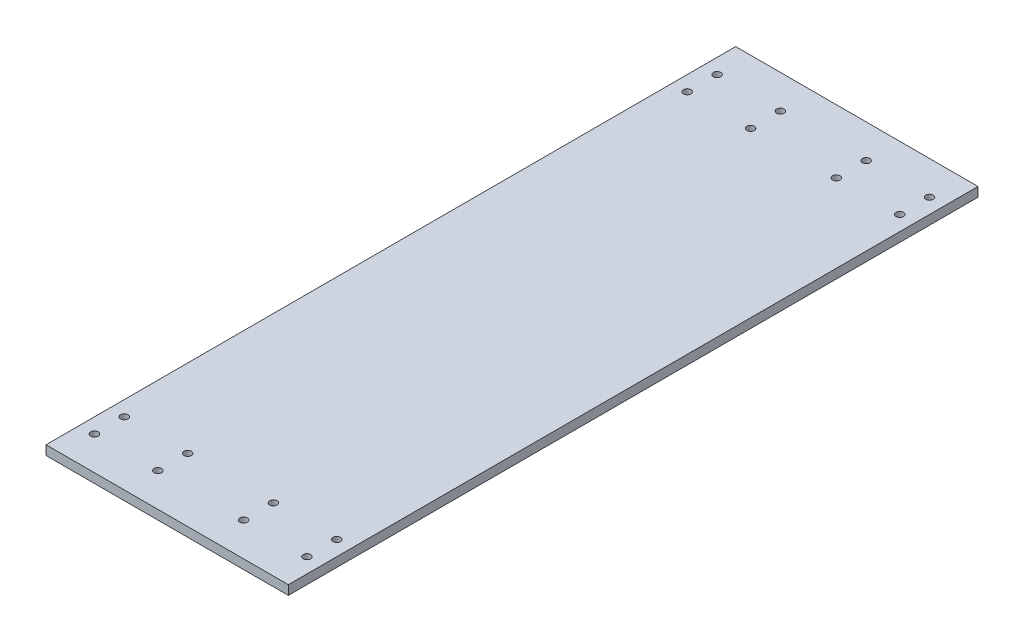
ISO-10303-21;
HEADER;
FILE_DESCRIPTION(('STEP AP214'),'2;1');
FILE_NAME('part.step','',(''),(''),'','','');
FILE_SCHEMA(('AUTOMOTIVE_DESIGN { 1 0 10303 214 1 1 1 1 }'));
ENDSEC;
DATA;
#1=APPLICATION_CONTEXT('core data for automotive mechanical design processes');
#2=APPLICATION_PROTOCOL_DEFINITION('international standard','automotive_design',2000,#1);
#3=PRODUCT_CONTEXT('',#1,'mechanical');
#4=PRODUCT('Part','Part','',(#3));
#5=PRODUCT_RELATED_PRODUCT_CATEGORY('part','',(#4));
#6=PRODUCT_DEFINITION_FORMATION('','',#4);
#7=PRODUCT_DEFINITION_CONTEXT('part definition',#1,'design');
#8=PRODUCT_DEFINITION('design','',#6,#7);
#9=PRODUCT_DEFINITION_SHAPE('','',#8);
#10=(LENGTH_UNIT() NAMED_UNIT(*) SI_UNIT(.MILLI.,.METRE.));
#11=(NAMED_UNIT(*) PLANE_ANGLE_UNIT() SI_UNIT($,.RADIAN.));
#12=(NAMED_UNIT(*) SI_UNIT($,.STERADIAN.) SOLID_ANGLE_UNIT());
#13=UNCERTAINTY_MEASURE_WITH_UNIT(LENGTH_MEASURE(1.E-05),#10,'distance_accuracy_value','');
#14=(GEOMETRIC_REPRESENTATION_CONTEXT(3) GLOBAL_UNCERTAINTY_ASSIGNED_CONTEXT((#13)) GLOBAL_UNIT_ASSIGNED_CONTEXT((#10,
#11,#12)) REPRESENTATION_CONTEXT('',''));
#15=CARTESIAN_POINT('',(0.,0.,0.));
#16=DIRECTION('',(0.,0.,1.));
#17=DIRECTION('',(1.,0.,0.));
#18=AXIS2_PLACEMENT_3D('',#15,#16,#17);
#19=CARTESIAN_POINT('',(65.,5.,185.));
#20=DIRECTION('',(-1.,0.,0.));
#21=DIRECTION('',(0.,0.,1.));
#22=AXIS2_PLACEMENT_3D('',#19,#20,#21);
#23=PLANE('',#22);
#24=DIRECTION('',(0.,0.,-1.));
#25=VECTOR('',#24,1.);
#26=CARTESIAN_POINT('',(65.,0.,185.));
#27=LINE('',#26,#25);
#28=CARTESIAN_POINT('',(65.,0.,185.));
#29=VERTEX_POINT('',#28);
#30=CARTESIAN_POINT('',(65.,0.,-185.));
#31=VERTEX_POINT('',#30);
#32=EDGE_CURVE('E102',#29,#31,#27,.T.);
#33=ORIENTED_EDGE('',*,*,#32,.T.);
#34=DIRECTION('',(0.,-1.,0.));
#35=VECTOR('',#34,1.);
#36=CARTESIAN_POINT('',(65.,5.,-185.));
#37=LINE('',#36,#35);
#38=CARTESIAN_POINT('',(65.,5.,-185.));
#39=VERTEX_POINT('',#38);
#40=EDGE_CURVE('E11',#39,#31,#37,.T.);
#41=ORIENTED_EDGE('',*,*,#40,.F.);
#42=DIRECTION('',(0.,0.,-1.));
#43=VECTOR('',#42,1.);
#44=CARTESIAN_POINT('',(65.,5.,185.));
#45=LINE('',#44,#43);
#46=CARTESIAN_POINT('',(65.,5.,185.));
#47=VERTEX_POINT('',#46);
#48=EDGE_CURVE('E89',#47,#39,#45,.T.);
#49=ORIENTED_EDGE('',*,*,#48,.F.);
#50=DIRECTION('',(0.,-1.,0.));
#51=VECTOR('',#50,1.);
#52=CARTESIAN_POINT('',(65.,5.,185.));
#53=LINE('',#52,#51);
#54=EDGE_CURVE('E98',#47,#29,#53,.T.);
#55=ORIENTED_EDGE('',*,*,#54,.T.);
#56=EDGE_LOOP('',(#33,#41,#49,#55));
#57=FACE_BOUND('',#56,.T.);
#58=ADVANCED_FACE('F36',(#57),#23,.F.);
#59=CARTESIAN_POINT('',(-65.,5.,-185.));
#60=DIRECTION('',(0.,0.,1.));
#61=DIRECTION('',(1.,0.,0.));
#62=AXIS2_PLACEMENT_3D('',#59,#60,#61);
#63=PLANE('',#62);
#64=DIRECTION('',(-1.,0.,0.));
#65=VECTOR('',#64,1.);
#66=CARTESIAN_POINT('',(-65.,0.,-185.));
#67=LINE('',#66,#65);
#68=CARTESIAN_POINT('',(-65.,0.,-185.));
#69=VERTEX_POINT('',#68);
#70=EDGE_CURVE('E93',#31,#69,#67,.T.);
#71=ORIENTED_EDGE('',*,*,#70,.T.);
#72=DIRECTION('',(0.,-1.,0.));
#73=VECTOR('',#72,1.);
#74=CARTESIAN_POINT('',(-65.,5.,-185.));
#75=LINE('',#74,#73);
#76=CARTESIAN_POINT('',(-65.,5.,-185.));
#77=VERTEX_POINT('',#76);
#78=EDGE_CURVE('E45',#77,#69,#75,.T.);
#79=ORIENTED_EDGE('',*,*,#78,.F.);
#80=DIRECTION('',(-1.,0.,0.));
#81=VECTOR('',#80,1.);
#82=CARTESIAN_POINT('',(-65.,5.,-185.));
#83=LINE('',#82,#81);
#84=EDGE_CURVE('E84',#39,#77,#83,.T.);
#85=ORIENTED_EDGE('',*,*,#84,.F.);
#86=ORIENTED_EDGE('',*,*,#40,.T.);
#87=EDGE_LOOP('',(#71,#79,#85,#86));
#88=FACE_BOUND('',#87,.T.);
#89=ADVANCED_FACE('F92',(#88),#63,.F.);
#90=CARTESIAN_POINT('',(-65.,5.,185.));
#91=DIRECTION('',(1.,0.,0.));
#92=DIRECTION('',(0.,0.,-1.));
#93=AXIS2_PLACEMENT_3D('',#90,#91,#92);
#94=PLANE('',#93);
#95=DIRECTION('',(0.,0.,1.));
#96=VECTOR('',#95,1.);
#97=CARTESIAN_POINT('',(-65.,0.,185.));
#98=LINE('',#97,#96);
#99=CARTESIAN_POINT('',(-65.,0.,185.));
#100=VERTEX_POINT('',#99);
#101=EDGE_CURVE('E71',#69,#100,#98,.T.);
#102=ORIENTED_EDGE('',*,*,#101,.T.);
#103=DIRECTION('',(0.,-1.,0.));
#104=VECTOR('',#103,1.);
#105=CARTESIAN_POINT('',(-65.,5.,185.));
#106=LINE('',#105,#104);
#107=CARTESIAN_POINT('',(-65.,5.,185.));
#108=VERTEX_POINT('',#107);
#109=EDGE_CURVE('E94',#108,#100,#106,.T.);
#110=ORIENTED_EDGE('',*,*,#109,.F.);
#111=DIRECTION('',(0.,0.,1.));
#112=VECTOR('',#111,1.);
#113=CARTESIAN_POINT('',(-65.,5.,185.));
#114=LINE('',#113,#112);
#115=EDGE_CURVE('E87',#77,#108,#114,.T.);
#116=ORIENTED_EDGE('',*,*,#115,.F.);
#117=ORIENTED_EDGE('',*,*,#78,.T.);
#118=EDGE_LOOP('',(#102,#110,#116,#117));
#119=FACE_BOUND('',#118,.T.);
#120=ADVANCED_FACE('F96',(#119),#94,.F.);
#121=CARTESIAN_POINT('',(-65.,5.,185.));
#122=DIRECTION('',(0.,0.,-1.));
#123=DIRECTION('',(-1.,0.,0.));
#124=AXIS2_PLACEMENT_3D('',#121,#122,#123);
#125=PLANE('',#124);
#126=DIRECTION('',(1.,0.,0.));
#127=VECTOR('',#126,1.);
#128=CARTESIAN_POINT('',(-65.,0.,185.));
#129=LINE('',#128,#127);
#130=EDGE_CURVE('E77',#100,#29,#129,.T.);
#131=ORIENTED_EDGE('',*,*,#130,.T.);
#132=ORIENTED_EDGE('',*,*,#54,.F.);
#133=DIRECTION('',(1.,0.,0.));
#134=VECTOR('',#133,1.);
#135=CARTESIAN_POINT('',(-65.,5.,185.));
#136=LINE('',#135,#134);
#137=EDGE_CURVE('E54',#108,#47,#136,.T.);
#138=ORIENTED_EDGE('',*,*,#137,.F.);
#139=ORIENTED_EDGE('',*,*,#109,.T.);
#140=EDGE_LOOP('',(#131,#132,#138,#139));
#141=FACE_BOUND('',#140,.T.);
#142=ADVANCED_FACE('F205',(#141),#125,.F.);
#143=CARTESIAN_POINT('',(0.,5.,0.));
#144=DIRECTION('',(0.,-1.,0.));
#145=DIRECTION('',(0.,0.,-1.));
#146=AXIS2_PLACEMENT_3D('',#143,#144,#145);
#147=PLANE('',#146);
#148=CARTESIAN_POINT('',(57.,5.,151.));
#149=DIRECTION('',(0.,1.,0.));
#150=DIRECTION('',(0.,0.,-1.));
#151=AXIS2_PLACEMENT_3D('',#148,#149,#150);
#152=CIRCLE('',#151,2.);
#153=CARTESIAN_POINT('',(57.,5.,149.));
#154=VERTEX_POINT('',#153);
#155=EDGE_CURVE('E407',#154,#154,#152,.T.);
#156=ORIENTED_EDGE('',*,*,#155,.F.);
#157=EDGE_LOOP('',(#156));
#158=FACE_BOUND('',#157,.T.);
#159=CARTESIAN_POINT('',(23.,5.,167.));
#160=DIRECTION('',(0.,1.,0.));
#161=DIRECTION('',(0.,0.,-1.));
#162=AXIS2_PLACEMENT_3D('',#159,#160,#161);
#163=CIRCLE('',#162,2.);
#164=CARTESIAN_POINT('',(23.,5.,165.));
#165=VERTEX_POINT('',#164);
#166=EDGE_CURVE('E408',#165,#165,#163,.T.);
#167=ORIENTED_EDGE('',*,*,#166,.F.);
#168=EDGE_LOOP('',(#167));
#169=FACE_BOUND('',#168,.T.);
#170=CARTESIAN_POINT('',(23.,5.,151.));
#171=DIRECTION('',(0.,1.,0.));
#172=DIRECTION('',(0.,0.,-1.));
#173=AXIS2_PLACEMENT_3D('',#170,#171,#172);
#174=CIRCLE('',#173,2.);
#175=CARTESIAN_POINT('',(23.,5.,149.));
#176=VERTEX_POINT('',#175);
#177=EDGE_CURVE('E412',#176,#176,#174,.T.);
#178=ORIENTED_EDGE('',*,*,#177,.F.);
#179=EDGE_LOOP('',(#178));
#180=FACE_BOUND('',#179,.T.);
#181=CARTESIAN_POINT('',(57.,5.,167.));
#182=DIRECTION('',(0.,1.,0.));
#183=DIRECTION('',(0.,0.,-1.));
#184=AXIS2_PLACEMENT_3D('',#181,#182,#183);
#185=CIRCLE('',#184,2.);
#186=CARTESIAN_POINT('',(57.,5.,165.));
#187=VERTEX_POINT('',#186);
#188=EDGE_CURVE('E155',#187,#187,#185,.T.);
#189=ORIENTED_EDGE('',*,*,#188,.F.);
#190=EDGE_LOOP('',(#189));
#191=FACE_BOUND('',#190,.T.);
#192=CARTESIAN_POINT('',(-57.,5.,151.));
#193=DIRECTION('',(0.,-1.,0.));
#194=DIRECTION('',(0.,0.,-1.));
#195=AXIS2_PLACEMENT_3D('',#192,#193,#194);
#196=CIRCLE('',#195,2.);
#197=CARTESIAN_POINT('',(-57.,5.,149.));
#198=VERTEX_POINT('',#197);
#199=EDGE_CURVE('E171',#198,#198,#196,.T.);
#200=ORIENTED_EDGE('',*,*,#199,.T.);
#201=EDGE_LOOP('',(#200));
#202=FACE_BOUND('',#201,.T.);
#203=CARTESIAN_POINT('',(-23.,5.,167.));
#204=DIRECTION('',(0.,-1.,0.));
#205=DIRECTION('',(0.,0.,-1.));
#206=AXIS2_PLACEMENT_3D('',#203,#204,#205);
#207=CIRCLE('',#206,2.);
#208=CARTESIAN_POINT('',(-23.,5.,165.));
#209=VERTEX_POINT('',#208);
#210=EDGE_CURVE('E166',#209,#209,#207,.T.);
#211=ORIENTED_EDGE('',*,*,#210,.T.);
#212=EDGE_LOOP('',(#211));
#213=FACE_BOUND('',#212,.T.);
#214=CARTESIAN_POINT('',(-23.,5.,151.));
#215=DIRECTION('',(0.,-1.,0.));
#216=DIRECTION('',(0.,0.,-1.));
#217=AXIS2_PLACEMENT_3D('',#214,#215,#216);
#218=CIRCLE('',#217,2.);
#219=CARTESIAN_POINT('',(-23.,5.,149.));
#220=VERTEX_POINT('',#219);
#221=EDGE_CURVE('E162',#220,#220,#218,.T.);
#222=ORIENTED_EDGE('',*,*,#221,.T.);
#223=EDGE_LOOP('',(#222));
#224=FACE_BOUND('',#223,.T.);
#225=CARTESIAN_POINT('',(-57.,5.,167.));
#226=DIRECTION('',(0.,-1.,0.));
#227=DIRECTION('',(0.,0.,-1.));
#228=AXIS2_PLACEMENT_3D('',#225,#226,#227);
#229=CIRCLE('',#228,2.);
#230=CARTESIAN_POINT('',(-57.,5.,165.));
#231=VERTEX_POINT('',#230);
#232=EDGE_CURVE('E141',#231,#231,#229,.T.);
#233=ORIENTED_EDGE('',*,*,#232,.T.);
#234=EDGE_LOOP('',(#233));
#235=FACE_BOUND('',#234,.T.);
#236=CARTESIAN_POINT('',(57.,5.,-151.));
#237=DIRECTION('',(0.,-1.,0.));
#238=DIRECTION('',(0.,0.,1.));
#239=AXIS2_PLACEMENT_3D('',#236,#237,#238);
#240=CIRCLE('',#239,2.);
#241=CARTESIAN_POINT('',(57.,5.,-149.));
#242=VERTEX_POINT('',#241);
#243=EDGE_CURVE('E183',#242,#242,#240,.T.);
#244=ORIENTED_EDGE('',*,*,#243,.T.);
#245=EDGE_LOOP('',(#244));
#246=FACE_BOUND('',#245,.T.);
#247=CARTESIAN_POINT('',(23.,5.,-167.));
#248=DIRECTION('',(0.,-1.,0.));
#249=DIRECTION('',(0.,0.,1.));
#250=AXIS2_PLACEMENT_3D('',#247,#248,#249);
#251=CIRCLE('',#250,2.);
#252=CARTESIAN_POINT('',(23.,5.,-165.));
#253=VERTEX_POINT('',#252);
#254=EDGE_CURVE('E182',#253,#253,#251,.T.);
#255=ORIENTED_EDGE('',*,*,#254,.T.);
#256=EDGE_LOOP('',(#255));
#257=FACE_BOUND('',#256,.T.);
#258=CARTESIAN_POINT('',(23.,5.,-151.));
#259=DIRECTION('',(0.,-1.,0.));
#260=DIRECTION('',(0.,0.,1.));
#261=AXIS2_PLACEMENT_3D('',#258,#259,#260);
#262=CIRCLE('',#261,2.);
#263=CARTESIAN_POINT('',(23.,5.,-149.));
#264=VERTEX_POINT('',#263);
#265=EDGE_CURVE('E150',#264,#264,#262,.T.);
#266=ORIENTED_EDGE('',*,*,#265,.T.);
#267=EDGE_LOOP('',(#266));
#268=FACE_BOUND('',#267,.T.);
#269=CARTESIAN_POINT('',(57.,5.,-167.));
#270=DIRECTION('',(0.,-1.,0.));
#271=DIRECTION('',(0.,0.,1.));
#272=AXIS2_PLACEMENT_3D('',#269,#270,#271);
#273=CIRCLE('',#272,2.);
#274=CARTESIAN_POINT('',(57.,5.,-165.));
#275=VERTEX_POINT('',#274);
#276=EDGE_CURVE('E127',#275,#275,#273,.T.);
#277=ORIENTED_EDGE('',*,*,#276,.T.);
#278=EDGE_LOOP('',(#277));
#279=FACE_BOUND('',#278,.T.);
#280=CARTESIAN_POINT('',(-57.,5.,-151.));
#281=DIRECTION('',(0.,1.,0.));
#282=DIRECTION('',(0.,0.,1.));
#283=AXIS2_PLACEMENT_3D('',#280,#281,#282);
#284=CIRCLE('',#283,2.);
#285=CARTESIAN_POINT('',(-57.,5.,-149.));
#286=VERTEX_POINT('',#285);
#287=EDGE_CURVE('E193',#286,#286,#284,.T.);
#288=ORIENTED_EDGE('',*,*,#287,.F.);
#289=EDGE_LOOP('',(#288));
#290=FACE_BOUND('',#289,.T.);
#291=CARTESIAN_POINT('',(-23.,5.,-167.));
#292=DIRECTION('',(0.,1.,0.));
#293=DIRECTION('',(0.,0.,1.));
#294=AXIS2_PLACEMENT_3D('',#291,#292,#293);
#295=CIRCLE('',#294,2.);
#296=CARTESIAN_POINT('',(-23.,5.,-165.));
#297=VERTEX_POINT('',#296);
#298=EDGE_CURVE('E192',#297,#297,#295,.T.);
#299=ORIENTED_EDGE('',*,*,#298,.F.);
#300=EDGE_LOOP('',(#299));
#301=FACE_BOUND('',#300,.T.);
#302=CARTESIAN_POINT('',(-23.,5.,-151.));
#303=DIRECTION('',(0.,1.,0.));
#304=DIRECTION('',(0.,0.,1.));
#305=AXIS2_PLACEMENT_3D('',#302,#303,#304);
#306=CIRCLE('',#305,2.);
#307=CARTESIAN_POINT('',(-23.,5.,-149.));
#308=VERTEX_POINT('',#307);
#309=EDGE_CURVE('E136',#308,#308,#306,.T.);
#310=ORIENTED_EDGE('',*,*,#309,.F.);
#311=EDGE_LOOP('',(#310));
#312=FACE_BOUND('',#311,.T.);
#313=CARTESIAN_POINT('',(-57.,5.,-167.));
#314=DIRECTION('',(0.,1.,0.));
#315=DIRECTION('',(0.,0.,1.));
#316=AXIS2_PLACEMENT_3D('',#313,#314,#315);
#317=CIRCLE('',#316,2.);
#318=CARTESIAN_POINT('',(-57.,5.,-165.));
#319=VERTEX_POINT('',#318);
#320=EDGE_CURVE('E115',#319,#319,#317,.T.);
#321=ORIENTED_EDGE('',*,*,#320,.F.);
#322=EDGE_LOOP('',(#321));
#323=FACE_BOUND('',#322,.T.);
#324=ORIENTED_EDGE('',*,*,#48,.T.);
#325=ORIENTED_EDGE('',*,*,#84,.T.);
#326=ORIENTED_EDGE('',*,*,#115,.T.);
#327=ORIENTED_EDGE('',*,*,#137,.T.);
#328=EDGE_LOOP('',(#324,#325,#326,#327));
#329=FACE_BOUND('',#328,.T.);
#330=ADVANCED_FACE('F85',(#158,#169,#180,#191,#202,#213,#224,#235,#246,#257,#268,#279,#290,#301,
#312,#323,#329),#147,.F.);
#331=CARTESIAN_POINT('',(0.,0.,0.));
#332=DIRECTION('',(0.,-1.,0.));
#333=DIRECTION('',(0.,0.,-1.));
#334=AXIS2_PLACEMENT_3D('',#331,#332,#333);
#335=PLANE('',#334);
#336=CARTESIAN_POINT('',(57.,0.,151.));
#337=DIRECTION('',(0.,-1.,0.));
#338=DIRECTION('',(0.,0.,-1.));
#339=AXIS2_PLACEMENT_3D('',#336,#337,#338);
#340=CIRCLE('',#339,2.);
#341=CARTESIAN_POINT('',(57.,0.,149.));
#342=VERTEX_POINT('',#341);
#343=EDGE_CURVE('E39',#342,#342,#340,.T.);
#344=ORIENTED_EDGE('',*,*,#343,.F.);
#345=EDGE_LOOP('',(#344));
#346=FACE_BOUND('',#345,.T.);
#347=CARTESIAN_POINT('',(23.,0.,167.));
#348=DIRECTION('',(0.,-1.,0.));
#349=DIRECTION('',(0.,0.,-1.));
#350=AXIS2_PLACEMENT_3D('',#347,#348,#349);
#351=CIRCLE('',#350,2.);
#352=CARTESIAN_POINT('',(23.,0.,165.));
#353=VERTEX_POINT('',#352);
#354=EDGE_CURVE('E157',#353,#353,#351,.T.);
#355=ORIENTED_EDGE('',*,*,#354,.F.);
#356=EDGE_LOOP('',(#355));
#357=FACE_BOUND('',#356,.T.);
#358=CARTESIAN_POINT('',(23.,0.,151.));
#359=DIRECTION('',(0.,-1.,0.));
#360=DIRECTION('',(0.,0.,-1.));
#361=AXIS2_PLACEMENT_3D('',#358,#359,#360);
#362=CIRCLE('',#361,2.);
#363=CARTESIAN_POINT('',(23.,0.,149.));
#364=VERTEX_POINT('',#363);
#365=EDGE_CURVE('E154',#364,#364,#362,.T.);
#366=ORIENTED_EDGE('',*,*,#365,.F.);
#367=EDGE_LOOP('',(#366));
#368=FACE_BOUND('',#367,.T.);
#369=CARTESIAN_POINT('',(57.,0.,167.));
#370=DIRECTION('',(0.,-1.,0.));
#371=DIRECTION('',(0.,0.,-1.));
#372=AXIS2_PLACEMENT_3D('',#369,#370,#371);
#373=CIRCLE('',#372,2.);
#374=CARTESIAN_POINT('',(57.,0.,165.));
#375=VERTEX_POINT('',#374);
#376=EDGE_CURVE('E151',#375,#375,#373,.T.);
#377=ORIENTED_EDGE('',*,*,#376,.F.);
#378=EDGE_LOOP('',(#377));
#379=FACE_BOUND('',#378,.T.);
#380=CARTESIAN_POINT('',(-57.,0.,151.));
#381=DIRECTION('',(0.,-1.,0.));
#382=DIRECTION('',(0.,0.,-1.));
#383=AXIS2_PLACEMENT_3D('',#380,#381,#382);
#384=CIRCLE('',#383,2.);
#385=CARTESIAN_POINT('',(-57.,0.,149.));
#386=VERTEX_POINT('',#385);
#387=EDGE_CURVE('E147',#386,#386,#384,.F.);
#388=ORIENTED_EDGE('',*,*,#387,.T.);
#389=EDGE_LOOP('',(#388));
#390=FACE_BOUND('',#389,.T.);
#391=CARTESIAN_POINT('',(-23.,0.,167.));
#392=DIRECTION('',(0.,-1.,0.));
#393=DIRECTION('',(0.,0.,-1.));
#394=AXIS2_PLACEMENT_3D('',#391,#392,#393);
#395=CIRCLE('',#394,2.);
#396=CARTESIAN_POINT('',(-23.,0.,165.));
#397=VERTEX_POINT('',#396);
#398=EDGE_CURVE('E144',#397,#397,#395,.F.);
#399=ORIENTED_EDGE('',*,*,#398,.T.);
#400=EDGE_LOOP('',(#399));
#401=FACE_BOUND('',#400,.T.);
#402=CARTESIAN_POINT('',(-23.,0.,151.));
#403=DIRECTION('',(0.,-1.,0.));
#404=DIRECTION('',(0.,0.,-1.));
#405=AXIS2_PLACEMENT_3D('',#402,#403,#404);
#406=CIRCLE('',#405,2.);
#407=CARTESIAN_POINT('',(-23.,0.,149.));
#408=VERTEX_POINT('',#407);
#409=EDGE_CURVE('E140',#408,#408,#406,.F.);
#410=ORIENTED_EDGE('',*,*,#409,.T.);
#411=EDGE_LOOP('',(#410));
#412=FACE_BOUND('',#411,.T.);
#413=CARTESIAN_POINT('',(-57.,0.,167.));
#414=DIRECTION('',(0.,-1.,0.));
#415=DIRECTION('',(0.,0.,-1.));
#416=AXIS2_PLACEMENT_3D('',#413,#414,#415);
#417=CIRCLE('',#416,2.);
#418=CARTESIAN_POINT('',(-57.,0.,165.));
#419=VERTEX_POINT('',#418);
#420=EDGE_CURVE('E137',#419,#419,#417,.F.);
#421=ORIENTED_EDGE('',*,*,#420,.T.);
#422=EDGE_LOOP('',(#421));
#423=FACE_BOUND('',#422,.T.);
#424=CARTESIAN_POINT('',(57.,0.,-151.));
#425=DIRECTION('',(0.,-1.,0.));
#426=DIRECTION('',(0.,0.,-1.));
#427=AXIS2_PLACEMENT_3D('',#424,#425,#426);
#428=CIRCLE('',#427,2.);
#429=CARTESIAN_POINT('',(57.,0.,-153.));
#430=VERTEX_POINT('',#429);
#431=EDGE_CURVE('E133',#430,#430,#428,.F.);
#432=ORIENTED_EDGE('',*,*,#431,.T.);
#433=EDGE_LOOP('',(#432));
#434=FACE_BOUND('',#433,.T.);
#435=CARTESIAN_POINT('',(23.,0.,-167.));
#436=DIRECTION('',(0.,-1.,0.));
#437=DIRECTION('',(0.,0.,-1.));
#438=AXIS2_PLACEMENT_3D('',#435,#436,#437);
#439=CIRCLE('',#438,2.);
#440=CARTESIAN_POINT('',(23.,0.,-169.));
#441=VERTEX_POINT('',#440);
#442=EDGE_CURVE('E130',#441,#441,#439,.F.);
#443=ORIENTED_EDGE('',*,*,#442,.T.);
#444=EDGE_LOOP('',(#443));
#445=FACE_BOUND('',#444,.T.);
#446=CARTESIAN_POINT('',(23.,0.,-151.));
#447=DIRECTION('',(0.,-1.,0.));
#448=DIRECTION('',(0.,0.,-1.));
#449=AXIS2_PLACEMENT_3D('',#446,#447,#448);
#450=CIRCLE('',#449,2.);
#451=CARTESIAN_POINT('',(23.,0.,-153.));
#452=VERTEX_POINT('',#451);
#453=EDGE_CURVE('E126',#452,#452,#450,.F.);
#454=ORIENTED_EDGE('',*,*,#453,.T.);
#455=EDGE_LOOP('',(#454));
#456=FACE_BOUND('',#455,.T.);
#457=CARTESIAN_POINT('',(57.,0.,-167.));
#458=DIRECTION('',(0.,-1.,0.));
#459=DIRECTION('',(0.,0.,-1.));
#460=AXIS2_PLACEMENT_3D('',#457,#458,#459);
#461=CIRCLE('',#460,2.);
#462=CARTESIAN_POINT('',(57.,0.,-169.));
#463=VERTEX_POINT('',#462);
#464=EDGE_CURVE('E123',#463,#463,#461,.F.);
#465=ORIENTED_EDGE('',*,*,#464,.T.);
#466=EDGE_LOOP('',(#465));
#467=FACE_BOUND('',#466,.T.);
#468=CARTESIAN_POINT('',(-57.,0.,-151.));
#469=DIRECTION('',(0.,-1.,0.));
#470=DIRECTION('',(0.,0.,-1.));
#471=AXIS2_PLACEMENT_3D('',#468,#469,#470);
#472=CIRCLE('',#471,2.);
#473=CARTESIAN_POINT('',(-57.,0.,-153.));
#474=VERTEX_POINT('',#473);
#475=EDGE_CURVE('E105',#474,#474,#472,.T.);
#476=ORIENTED_EDGE('',*,*,#475,.F.);
#477=EDGE_LOOP('',(#476));
#478=FACE_BOUND('',#477,.T.);
#479=CARTESIAN_POINT('',(-23.,0.,-167.));
#480=DIRECTION('',(0.,-1.,0.));
#481=DIRECTION('',(0.,0.,-1.));
#482=AXIS2_PLACEMENT_3D('',#479,#480,#481);
#483=CIRCLE('',#482,2.);
#484=CARTESIAN_POINT('',(-23.,0.,-169.));
#485=VERTEX_POINT('',#484);
#486=EDGE_CURVE('E118',#485,#485,#483,.T.);
#487=ORIENTED_EDGE('',*,*,#486,.F.);
#488=EDGE_LOOP('',(#487));
#489=FACE_BOUND('',#488,.T.);
#490=CARTESIAN_POINT('',(-23.,0.,-151.));
#491=DIRECTION('',(0.,-1.,0.));
#492=DIRECTION('',(0.,0.,-1.));
#493=AXIS2_PLACEMENT_3D('',#490,#491,#492);
#494=CIRCLE('',#493,2.);
#495=CARTESIAN_POINT('',(-23.,0.,-153.));
#496=VERTEX_POINT('',#495);
#497=EDGE_CURVE('E114',#496,#496,#494,.T.);
#498=ORIENTED_EDGE('',*,*,#497,.F.);
#499=EDGE_LOOP('',(#498));
#500=FACE_BOUND('',#499,.T.);
#501=CARTESIAN_POINT('',(-57.,0.,-167.));
#502=DIRECTION('',(0.,-1.,0.));
#503=DIRECTION('',(0.,0.,-1.));
#504=AXIS2_PLACEMENT_3D('',#501,#502,#503);
#505=CIRCLE('',#504,2.);
#506=CARTESIAN_POINT('',(-57.,0.,-169.));
#507=VERTEX_POINT('',#506);
#508=EDGE_CURVE('E111',#507,#507,#505,.T.);
#509=ORIENTED_EDGE('',*,*,#508,.F.);
#510=EDGE_LOOP('',(#509));
#511=FACE_BOUND('',#510,.T.);
#512=ORIENTED_EDGE('',*,*,#32,.F.);
#513=ORIENTED_EDGE('',*,*,#130,.F.);
#514=ORIENTED_EDGE('',*,*,#101,.F.);
#515=ORIENTED_EDGE('',*,*,#70,.F.);
#516=EDGE_LOOP('',(#512,#513,#514,#515));
#517=FACE_BOUND('',#516,.T.);
#518=ADVANCED_FACE('F204',(#346,#357,#368,#379,#390,#401,#412,#423,#434,#445,#456,#467,#478,
#489,#500,#511,#517),#335,.T.);
#519=CARTESIAN_POINT('',(-57.,-5.,-167.));
#520=DIRECTION('',(0.,1.,0.));
#521=DIRECTION('',(0.,0.,1.));
#522=AXIS2_PLACEMENT_3D('',#519,#520,#521);
#523=CYLINDRICAL_SURFACE('',#522,2.);
#524=ORIENTED_EDGE('',*,*,#508,.T.);
#525=EDGE_LOOP('',(#524));
#526=FACE_BOUND('',#525,.T.);
#527=ORIENTED_EDGE('',*,*,#320,.T.);
#528=EDGE_LOOP('',(#527));
#529=FACE_BOUND('',#528,.T.);
#530=ADVANCED_FACE('F201',(#526,#529),#523,.F.);
#531=CARTESIAN_POINT('',(-23.,-5.,-151.));
#532=DIRECTION('',(0.,1.,0.));
#533=DIRECTION('',(0.,0.,1.));
#534=AXIS2_PLACEMENT_3D('',#531,#532,#533);
#535=CYLINDRICAL_SURFACE('',#534,2.);
#536=ORIENTED_EDGE('',*,*,#497,.T.);
#537=EDGE_LOOP('',(#536));
#538=FACE_BOUND('',#537,.T.);
#539=ORIENTED_EDGE('',*,*,#309,.T.);
#540=EDGE_LOOP('',(#539));
#541=FACE_BOUND('',#540,.T.);
#542=ADVANCED_FACE('F245',(#538,#541),#535,.F.);
#543=CARTESIAN_POINT('',(-23.,-5.,-167.));
#544=DIRECTION('',(0.,1.,0.));
#545=DIRECTION('',(0.,0.,1.));
#546=AXIS2_PLACEMENT_3D('',#543,#544,#545);
#547=CYLINDRICAL_SURFACE('',#546,2.);
#548=ORIENTED_EDGE('',*,*,#486,.T.);
#549=EDGE_LOOP('',(#548));
#550=FACE_BOUND('',#549,.T.);
#551=ORIENTED_EDGE('',*,*,#298,.T.);
#552=EDGE_LOOP('',(#551));
#553=FACE_BOUND('',#552,.T.);
#554=ADVANCED_FACE('F255',(#550,#553),#547,.F.);
#555=CARTESIAN_POINT('',(-57.,-5.,-151.));
#556=DIRECTION('',(0.,1.,0.));
#557=DIRECTION('',(0.,0.,1.));
#558=AXIS2_PLACEMENT_3D('',#555,#556,#557);
#559=CYLINDRICAL_SURFACE('',#558,2.);
#560=ORIENTED_EDGE('',*,*,#475,.T.);
#561=EDGE_LOOP('',(#560));
#562=FACE_BOUND('',#561,.T.);
#563=ORIENTED_EDGE('',*,*,#287,.T.);
#564=EDGE_LOOP('',(#563));
#565=FACE_BOUND('',#564,.T.);
#566=ADVANCED_FACE('F265',(#562,#565),#559,.F.);
#567=CARTESIAN_POINT('',(57.,-5.,-167.));
#568=DIRECTION('',(0.,1.,0.));
#569=DIRECTION('',(0.,0.,1.));
#570=AXIS2_PLACEMENT_3D('',#567,#568,#569);
#571=CYLINDRICAL_SURFACE('',#570,2.);
#572=ORIENTED_EDGE('',*,*,#464,.F.);
#573=EDGE_LOOP('',(#572));
#574=FACE_BOUND('',#573,.T.);
#575=ORIENTED_EDGE('',*,*,#276,.F.);
#576=EDGE_LOOP('',(#575));
#577=FACE_BOUND('',#576,.T.);
#578=ADVANCED_FACE('F274',(#574,#577),#571,.F.);
#579=CARTESIAN_POINT('',(23.,-5.,-151.));
#580=DIRECTION('',(0.,1.,0.));
#581=DIRECTION('',(0.,0.,1.));
#582=AXIS2_PLACEMENT_3D('',#579,#580,#581);
#583=CYLINDRICAL_SURFACE('',#582,2.);
#584=ORIENTED_EDGE('',*,*,#453,.F.);
#585=EDGE_LOOP('',(#584));
#586=FACE_BOUND('',#585,.T.);
#587=ORIENTED_EDGE('',*,*,#265,.F.);
#588=EDGE_LOOP('',(#587));
#589=FACE_BOUND('',#588,.T.);
#590=ADVANCED_FACE('F293',(#586,#589),#583,.F.);
#591=CARTESIAN_POINT('',(23.,-5.,-167.));
#592=DIRECTION('',(0.,1.,0.));
#593=DIRECTION('',(0.,0.,1.));
#594=AXIS2_PLACEMENT_3D('',#591,#592,#593);
#595=CYLINDRICAL_SURFACE('',#594,2.);
#596=ORIENTED_EDGE('',*,*,#442,.F.);
#597=EDGE_LOOP('',(#596));
#598=FACE_BOUND('',#597,.T.);
#599=ORIENTED_EDGE('',*,*,#254,.F.);
#600=EDGE_LOOP('',(#599));
#601=FACE_BOUND('',#600,.T.);
#602=ADVANCED_FACE('F303',(#598,#601),#595,.F.);
#603=CARTESIAN_POINT('',(57.,-5.,-151.));
#604=DIRECTION('',(0.,1.,0.));
#605=DIRECTION('',(0.,0.,1.));
#606=AXIS2_PLACEMENT_3D('',#603,#604,#605);
#607=CYLINDRICAL_SURFACE('',#606,2.);
#608=ORIENTED_EDGE('',*,*,#431,.F.);
#609=EDGE_LOOP('',(#608));
#610=FACE_BOUND('',#609,.T.);
#611=ORIENTED_EDGE('',*,*,#243,.F.);
#612=EDGE_LOOP('',(#611));
#613=FACE_BOUND('',#612,.T.);
#614=ADVANCED_FACE('F313',(#610,#613),#607,.F.);
#615=CARTESIAN_POINT('',(-57.,-5.,167.));
#616=DIRECTION('',(0.,1.,0.));
#617=DIRECTION('',(0.,0.,1.));
#618=AXIS2_PLACEMENT_3D('',#615,#616,#617);
#619=CYLINDRICAL_SURFACE('',#618,2.);
#620=ORIENTED_EDGE('',*,*,#420,.F.);
#621=EDGE_LOOP('',(#620));
#622=FACE_BOUND('',#621,.T.);
#623=ORIENTED_EDGE('',*,*,#232,.F.);
#624=EDGE_LOOP('',(#623));
#625=FACE_BOUND('',#624,.T.);
#626=ADVANCED_FACE('F323',(#622,#625),#619,.F.);
#627=CARTESIAN_POINT('',(-23.,-5.,151.));
#628=DIRECTION('',(0.,1.,0.));
#629=DIRECTION('',(0.,0.,1.));
#630=AXIS2_PLACEMENT_3D('',#627,#628,#629);
#631=CYLINDRICAL_SURFACE('',#630,2.);
#632=ORIENTED_EDGE('',*,*,#409,.F.);
#633=EDGE_LOOP('',(#632));
#634=FACE_BOUND('',#633,.T.);
#635=ORIENTED_EDGE('',*,*,#221,.F.);
#636=EDGE_LOOP('',(#635));
#637=FACE_BOUND('',#636,.T.);
#638=ADVANCED_FACE('F333',(#634,#637),#631,.F.);
#639=CARTESIAN_POINT('',(-23.,-5.,167.));
#640=DIRECTION('',(0.,1.,0.));
#641=DIRECTION('',(0.,0.,1.));
#642=AXIS2_PLACEMENT_3D('',#639,#640,#641);
#643=CYLINDRICAL_SURFACE('',#642,2.);
#644=ORIENTED_EDGE('',*,*,#398,.F.);
#645=EDGE_LOOP('',(#644));
#646=FACE_BOUND('',#645,.T.);
#647=ORIENTED_EDGE('',*,*,#210,.F.);
#648=EDGE_LOOP('',(#647));
#649=FACE_BOUND('',#648,.T.);
#650=ADVANCED_FACE('F343',(#646,#649),#643,.F.);
#651=CARTESIAN_POINT('',(-57.,-5.,151.));
#652=DIRECTION('',(0.,1.,0.));
#653=DIRECTION('',(0.,0.,1.));
#654=AXIS2_PLACEMENT_3D('',#651,#652,#653);
#655=CYLINDRICAL_SURFACE('',#654,2.);
#656=ORIENTED_EDGE('',*,*,#387,.F.);
#657=EDGE_LOOP('',(#656));
#658=FACE_BOUND('',#657,.T.);
#659=ORIENTED_EDGE('',*,*,#199,.F.);
#660=EDGE_LOOP('',(#659));
#661=FACE_BOUND('',#660,.T.);
#662=ADVANCED_FACE('F353',(#658,#661),#655,.F.);
#663=CARTESIAN_POINT('',(57.,-5.,167.));
#664=DIRECTION('',(0.,1.,0.));
#665=DIRECTION('',(0.,0.,1.));
#666=AXIS2_PLACEMENT_3D('',#663,#664,#665);
#667=CYLINDRICAL_SURFACE('',#666,2.);
#668=ORIENTED_EDGE('',*,*,#376,.T.);
#669=EDGE_LOOP('',(#668));
#670=FACE_BOUND('',#669,.T.);
#671=ORIENTED_EDGE('',*,*,#188,.T.);
#672=EDGE_LOOP('',(#671));
#673=FACE_BOUND('',#672,.T.);
#674=ADVANCED_FACE('F363',(#670,#673),#667,.F.);
#675=CARTESIAN_POINT('',(23.,-5.,151.));
#676=DIRECTION('',(0.,1.,0.));
#677=DIRECTION('',(0.,0.,1.));
#678=AXIS2_PLACEMENT_3D('',#675,#676,#677);
#679=CYLINDRICAL_SURFACE('',#678,2.);
#680=ORIENTED_EDGE('',*,*,#365,.T.);
#681=EDGE_LOOP('',(#680));
#682=FACE_BOUND('',#681,.T.);
#683=ORIENTED_EDGE('',*,*,#177,.T.);
#684=EDGE_LOOP('',(#683));
#685=FACE_BOUND('',#684,.T.);
#686=ADVANCED_FACE('F373',(#682,#685),#679,.F.);
#687=CARTESIAN_POINT('',(23.,-5.,167.));
#688=DIRECTION('',(0.,1.,0.));
#689=DIRECTION('',(0.,0.,1.));
#690=AXIS2_PLACEMENT_3D('',#687,#688,#689);
#691=CYLINDRICAL_SURFACE('',#690,2.);
#692=ORIENTED_EDGE('',*,*,#354,.T.);
#693=EDGE_LOOP('',(#692));
#694=FACE_BOUND('',#693,.T.);
#695=ORIENTED_EDGE('',*,*,#166,.T.);
#696=EDGE_LOOP('',(#695));
#697=FACE_BOUND('',#696,.T.);
#698=ADVANCED_FACE('F383',(#694,#697),#691,.F.);
#699=CARTESIAN_POINT('',(57.,-5.,151.));
#700=DIRECTION('',(0.,1.,0.));
#701=DIRECTION('',(0.,0.,1.));
#702=AXIS2_PLACEMENT_3D('',#699,#700,#701);
#703=CYLINDRICAL_SURFACE('',#702,2.);
#704=ORIENTED_EDGE('',*,*,#343,.T.);
#705=EDGE_LOOP('',(#704));
#706=FACE_BOUND('',#705,.T.);
#707=ORIENTED_EDGE('',*,*,#155,.T.);
#708=EDGE_LOOP('',(#707));
#709=FACE_BOUND('',#708,.T.);
#710=ADVANCED_FACE('F393',(#706,#709),#703,.F.);
#711=CLOSED_SHELL('',(#58,#89,#120,#142,#330,#518,#530,#542,#554,#566,#578,#590,#602,#614,#626,
#638,#650,#662,#674,#686,#698,#710));
#712=MANIFOLD_SOLID_BREP('B2',#711);
#713=ADVANCED_BREP_SHAPE_REPRESENTATION('',(#18,#712),#14);
#714=SHAPE_DEFINITION_REPRESENTATION(#9,#713);
ENDSEC;
END-ISO-10303-21;
